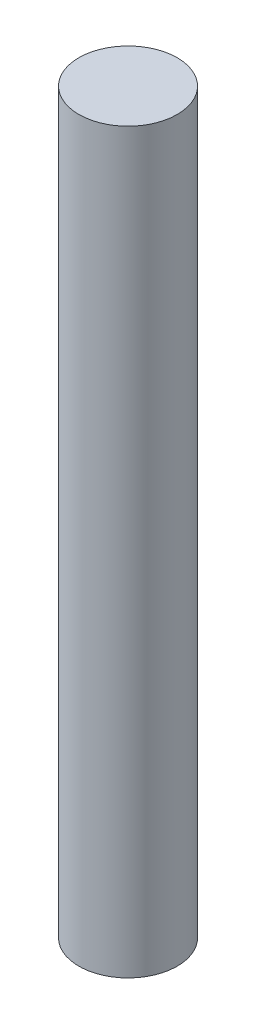
ISO-10303-21;
HEADER;
FILE_DESCRIPTION(('STEP AP214'),'2;1');
FILE_NAME('part.step','',(''),(''),'','','');
FILE_SCHEMA(('AUTOMOTIVE_DESIGN { 1 0 10303 214 1 1 1 1 }'));
ENDSEC;
DATA;
#1=APPLICATION_CONTEXT('core data for automotive mechanical design processes');
#2=APPLICATION_PROTOCOL_DEFINITION('international standard','automotive_design',2000,#1);
#3=PRODUCT_CONTEXT('',#1,'mechanical');
#4=PRODUCT('Part','Part','',(#3));
#5=PRODUCT_RELATED_PRODUCT_CATEGORY('part','',(#4));
#6=PRODUCT_DEFINITION_FORMATION('','',#4);
#7=PRODUCT_DEFINITION_CONTEXT('part definition',#1,'design');
#8=PRODUCT_DEFINITION('design','',#6,#7);
#9=PRODUCT_DEFINITION_SHAPE('','',#8);
#10=(LENGTH_UNIT() NAMED_UNIT(*) SI_UNIT(.MILLI.,.METRE.));
#11=(NAMED_UNIT(*) PLANE_ANGLE_UNIT() SI_UNIT($,.RADIAN.));
#12=(NAMED_UNIT(*) SI_UNIT($,.STERADIAN.) SOLID_ANGLE_UNIT());
#13=UNCERTAINTY_MEASURE_WITH_UNIT(LENGTH_MEASURE(1.E-05),#10,'distance_accuracy_value','');
#14=(GEOMETRIC_REPRESENTATION_CONTEXT(3) GLOBAL_UNCERTAINTY_ASSIGNED_CONTEXT((#13)) GLOBAL_UNIT_ASSIGNED_CONTEXT((#10,
#11,#12)) REPRESENTATION_CONTEXT('',''));
#15=CARTESIAN_POINT('',(0.,0.,0.));
#16=DIRECTION('',(0.,0.,1.));
#17=DIRECTION('',(1.,0.,0.));
#18=AXIS2_PLACEMENT_3D('',#15,#16,#17);
#19=CARTESIAN_POINT('',(0.,7.,0.));
#20=DIRECTION('',(0.,-1.,0.));
#21=DIRECTION('',(0.,0.,-1.));
#22=AXIS2_PLACEMENT_3D('',#19,#20,#21);
#23=CYLINDRICAL_SURFACE('',#22,5.);
#24=CARTESIAN_POINT('',(0.,7.,0.));
#25=DIRECTION('',(0.,1.,0.));
#26=DIRECTION('',(0.,0.,1.));
#27=AXIS2_PLACEMENT_3D('',#24,#25,#26);
#28=CIRCLE('',#27,5.);
#29=CARTESIAN_POINT('',(0.,7.,5.));
#30=VERTEX_POINT('',#29);
#31=EDGE_CURVE('E10',#30,#30,#28,.T.);
#32=ORIENTED_EDGE('',*,*,#31,.F.);
#33=EDGE_LOOP('',(#32));
#34=FACE_BOUND('',#33,.T.);
#35=CARTESIAN_POINT('',(0.,-68.,0.));
#36=DIRECTION('',(0.,-1.,0.));
#37=DIRECTION('',(0.,0.,-1.));
#38=AXIS2_PLACEMENT_3D('',#35,#36,#37);
#39=CIRCLE('',#38,5.);
#40=CARTESIAN_POINT('',(0.,-68.,-5.));
#41=VERTEX_POINT('',#40);
#42=EDGE_CURVE('E44',#41,#41,#39,.T.);
#43=ORIENTED_EDGE('',*,*,#42,.F.);
#44=EDGE_LOOP('',(#43));
#45=FACE_BOUND('',#44,.T.);
#46=ADVANCED_FACE('F37',(#34,#45),#23,.T.);
#47=CARTESIAN_POINT('',(0.,7.,0.));
#48=DIRECTION('',(0.,1.,0.));
#49=DIRECTION('',(0.,0.,1.));
#50=AXIS2_PLACEMENT_3D('',#47,#48,#49);
#51=PLANE('',#50);
#52=ORIENTED_EDGE('',*,*,#31,.T.);
#53=EDGE_LOOP('',(#52));
#54=FACE_BOUND('',#53,.T.);
#55=ADVANCED_FACE('F65',(#54),#51,.T.);
#56=CARTESIAN_POINT('',(0.,-68.,0.));
#57=DIRECTION('',(0.,-1.,0.));
#58=DIRECTION('',(0.,0.,-1.));
#59=AXIS2_PLACEMENT_3D('',#56,#57,#58);
#60=PLANE('',#59);
#61=CARTESIAN_POINT('',(0.,-68.,0.));
#62=DIRECTION('',(0.,-1.,0.));
#63=DIRECTION('',(0.,0.,-1.));
#64=AXIS2_PLACEMENT_3D('',#61,#62,#63);
#65=CIRCLE('',#64,3.5);
#66=CARTESIAN_POINT('',(0.,-68.,-3.5));
#67=VERTEX_POINT('',#66);
#68=EDGE_CURVE('E54',#67,#67,#65,.T.);
#69=ORIENTED_EDGE('',*,*,#68,.F.);
#70=EDGE_LOOP('',(#69));
#71=FACE_BOUND('',#70,.T.);
#72=ORIENTED_EDGE('',*,*,#42,.T.);
#73=EDGE_LOOP('',(#72));
#74=FACE_BOUND('',#73,.T.);
#75=ADVANCED_FACE('F63',(#71,#74),#60,.T.);
#76=CARTESIAN_POINT('',(0.,-48.,0.));
#77=DIRECTION('',(0.,-1.,0.));
#78=DIRECTION('',(0.,0.,-1.));
#79=AXIS2_PLACEMENT_3D('',#76,#77,#78);
#80=CYLINDRICAL_SURFACE('',#79,3.5);
#81=CARTESIAN_POINT('',(0.,-48.,0.));
#82=DIRECTION('',(0.,-1.,0.));
#83=DIRECTION('',(0.,0.,-1.));
#84=AXIS2_PLACEMENT_3D('',#81,#82,#83);
#85=CIRCLE('',#84,3.5);
#86=CARTESIAN_POINT('',(0.,-48.,-3.5));
#87=VERTEX_POINT('',#86);
#88=EDGE_CURVE('E49',#87,#87,#85,.T.);
#89=ORIENTED_EDGE('',*,*,#88,.F.);
#90=EDGE_LOOP('',(#89));
#91=FACE_BOUND('',#90,.T.);
#92=ORIENTED_EDGE('',*,*,#68,.T.);
#93=EDGE_LOOP('',(#92));
#94=FACE_BOUND('',#93,.T.);
#95=ADVANCED_FACE('F61',(#91,#94),#80,.F.);
#96=CARTESIAN_POINT('',(0.,-48.,0.));
#97=DIRECTION('',(0.,-1.,0.));
#98=DIRECTION('',(0.,0.,-1.));
#99=AXIS2_PLACEMENT_3D('',#96,#97,#98);
#100=PLANE('',#99);
#101=ORIENTED_EDGE('',*,*,#88,.T.);
#102=EDGE_LOOP('',(#101));
#103=FACE_BOUND('',#102,.T.);
#104=ADVANCED_FACE('F71',(#103),#100,.T.);
#105=CLOSED_SHELL('',(#46,#55,#75,#95,#104));
#106=MANIFOLD_SOLID_BREP('B2',#105);
#107=ADVANCED_BREP_SHAPE_REPRESENTATION('',(#18,#106),#14);
#108=SHAPE_DEFINITION_REPRESENTATION(#9,#107);
ENDSEC;
END-ISO-10303-21;
